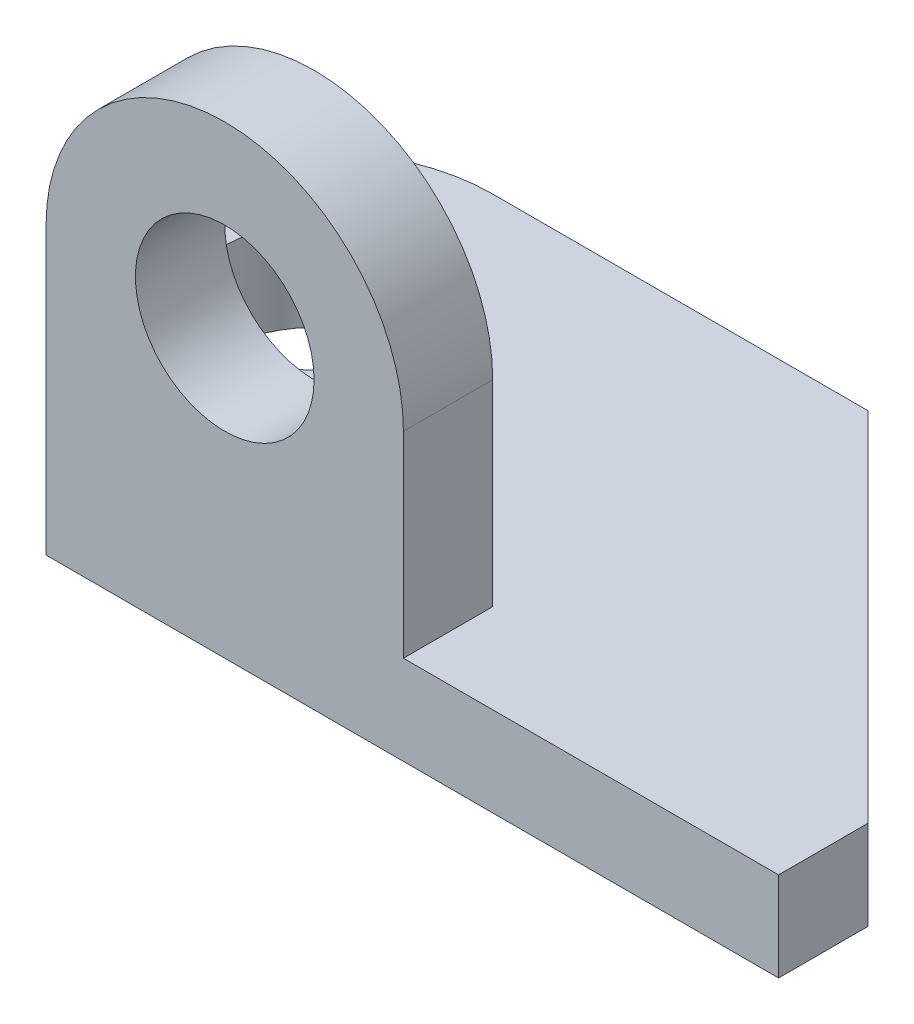
ISO-10303-21;
HEADER;
FILE_DESCRIPTION(('STEP AP214'),'2;1');
FILE_NAME('part.step','',(''),(''),'','','');
FILE_SCHEMA(('AUTOMOTIVE_DESIGN { 1 0 10303 214 1 1 1 1 }'));
ENDSEC;
DATA;
#1=APPLICATION_CONTEXT('core data for automotive mechanical design processes');
#2=APPLICATION_PROTOCOL_DEFINITION('international standard','automotive_design',2000,#1);
#3=PRODUCT_CONTEXT('',#1,'mechanical');
#4=PRODUCT('Part','Part','',(#3));
#5=PRODUCT_RELATED_PRODUCT_CATEGORY('part','',(#4));
#6=PRODUCT_DEFINITION_FORMATION('','',#4);
#7=PRODUCT_DEFINITION_CONTEXT('part definition',#1,'design');
#8=PRODUCT_DEFINITION('design','',#6,#7);
#9=PRODUCT_DEFINITION_SHAPE('','',#8);
#10=(LENGTH_UNIT() NAMED_UNIT(*) SI_UNIT(.MILLI.,.METRE.));
#11=(NAMED_UNIT(*) PLANE_ANGLE_UNIT() SI_UNIT($,.RADIAN.));
#12=(NAMED_UNIT(*) SI_UNIT($,.STERADIAN.) SOLID_ANGLE_UNIT());
#13=UNCERTAINTY_MEASURE_WITH_UNIT(LENGTH_MEASURE(1.E-05),#10,'distance_accuracy_value','');
#14=(GEOMETRIC_REPRESENTATION_CONTEXT(3) GLOBAL_UNCERTAINTY_ASSIGNED_CONTEXT((#13)) GLOBAL_UNIT_ASSIGNED_CONTEXT((#10,
#11,#12)) REPRESENTATION_CONTEXT('',''));
#15=CARTESIAN_POINT('',(0.,0.,0.));
#16=DIRECTION('',(0.,0.,1.));
#17=DIRECTION('',(1.,0.,0.));
#18=AXIS2_PLACEMENT_3D('',#15,#16,#17);
#19=CARTESIAN_POINT('',(0.,254.,-762.));
#20=DIRECTION('',(0.,-1.,0.));
#21=DIRECTION('',(0.,0.,-1.));
#22=AXIS2_PLACEMENT_3D('',#19,#20,#21);
#23=CYLINDRICAL_SURFACE('',#22,508.);
#24=CARTESIAN_POINT('',(0.,0.,-762.));
#25=DIRECTION('',(0.,1.,0.));
#26=DIRECTION('',(0.,0.,1.));
#27=AXIS2_PLACEMENT_3D('',#24,#25,#26);
#28=CIRCLE('',#27,508.);
#29=CARTESIAN_POINT('',(-1.24424117310977E-13,0.,-1270.));
#30=VERTEX_POINT('',#29);
#31=CARTESIAN_POINT('',(0.,0.,-254.));
#32=VERTEX_POINT('',#31);
#33=EDGE_CURVE('E146',#30,#32,#28,.T.);
#34=ORIENTED_EDGE('',*,*,#33,.T.);
#35=DIRECTION('',(0.,-1.,0.));
#36=VECTOR('',#35,1.);
#37=CARTESIAN_POINT('',(0.,254.,-254.));
#38=LINE('',#37,#36);
#39=CARTESIAN_POINT('',(0.,254.,-254.));
#40=VERTEX_POINT('',#39);
#41=EDGE_CURVE('E11',#40,#32,#38,.T.);
#42=ORIENTED_EDGE('',*,*,#41,.F.);
#43=CARTESIAN_POINT('',(0.,254.,-762.));
#44=DIRECTION('',(0.,1.,0.));
#45=DIRECTION('',(0.,0.,1.));
#46=AXIS2_PLACEMENT_3D('',#43,#44,#45);
#47=CIRCLE('',#46,508.);
#48=CARTESIAN_POINT('',(-1.24424117310977E-13,254.,-1270.));
#49=VERTEX_POINT('',#48);
#50=EDGE_CURVE('E148',#49,#40,#47,.T.);
#51=ORIENTED_EDGE('',*,*,#50,.F.);
#52=DIRECTION('',(0.,-1.,0.));
#53=VECTOR('',#52,1.);
#54=CARTESIAN_POINT('',(-1.24424117310977E-13,254.,-1270.));
#55=LINE('',#54,#53);
#56=EDGE_CURVE('E160',#49,#30,#55,.T.);
#57=ORIENTED_EDGE('',*,*,#56,.T.);
#58=EDGE_LOOP('',(#34,#42,#51,#57));
#59=FACE_BOUND('',#58,.T.);
#60=ADVANCED_FACE('F33',(#59),#23,.T.);
#61=CARTESIAN_POINT('',(0.,254.,0.));
#62=DIRECTION('',(1.,0.,0.));
#63=DIRECTION('',(0.,0.,-1.));
#64=AXIS2_PLACEMENT_3D('',#61,#62,#63);
#65=PLANE('',#64);
#66=DIRECTION('',(0.,0.,1.));
#67=VECTOR('',#66,1.);
#68=CARTESIAN_POINT('',(0.,0.,0.));
#69=LINE('',#68,#67);
#70=CARTESIAN_POINT('',(0.,0.,0.));
#71=VERTEX_POINT('',#70);
#72=EDGE_CURVE('E163',#32,#71,#69,.T.);
#73=ORIENTED_EDGE('',*,*,#72,.T.);
#74=DIRECTION('',(0.,-1.,0.));
#75=VECTOR('',#74,1.);
#76=CARTESIAN_POINT('',(0.,254.,0.));
#77=LINE('',#76,#75);
#78=CARTESIAN_POINT('',(0.,812.8,0.));
#79=VERTEX_POINT('',#78);
#80=EDGE_CURVE('E40',#79,#71,#77,.T.);
#81=ORIENTED_EDGE('',*,*,#80,.F.);
#82=DIRECTION('',(0.,0.,1.));
#83=VECTOR('',#82,1.);
#84=CARTESIAN_POINT('',(0.,812.8,-254.));
#85=LINE('',#84,#83);
#86=CARTESIAN_POINT('',(0.,812.8,-254.));
#87=VERTEX_POINT('',#86);
#88=EDGE_CURVE('E121',#87,#79,#85,.T.);
#89=ORIENTED_EDGE('',*,*,#88,.F.);
#90=DIRECTION('',(0.,1.,0.));
#91=VECTOR('',#90,1.);
#92=CARTESIAN_POINT('',(0.,0.,-254.));
#93=LINE('',#92,#91);
#94=EDGE_CURVE('E110',#40,#87,#93,.T.);
#95=ORIENTED_EDGE('',*,*,#94,.F.);
#96=ORIENTED_EDGE('',*,*,#41,.T.);
#97=EDGE_LOOP('',(#73,#81,#89,#95,#96));
#98=FACE_BOUND('',#97,.T.);
#99=ADVANCED_FACE('F122',(#98),#65,.F.);
#100=CARTESIAN_POINT('',(0.,254.,0.));
#101=DIRECTION('',(0.,0.,-1.));
#102=DIRECTION('',(-1.,0.,0.));
#103=AXIS2_PLACEMENT_3D('',#100,#101,#102);
#104=PLANE('',#103);
#105=DIRECTION('',(1.,0.,0.));
#106=VECTOR('',#105,1.);
#107=CARTESIAN_POINT('',(0.,0.,0.));
#108=LINE('',#107,#106);
#109=CARTESIAN_POINT('',(2082.8,0.,0.));
#110=VERTEX_POINT('',#109);
#111=EDGE_CURVE('E165',#71,#110,#108,.T.);
#112=ORIENTED_EDGE('',*,*,#111,.T.);
#113=DIRECTION('',(0.,-1.,0.));
#114=VECTOR('',#113,1.);
#115=CARTESIAN_POINT('',(2082.8,254.,0.));
#116=LINE('',#115,#114);
#117=CARTESIAN_POINT('',(2082.8,254.,0.));
#118=VERTEX_POINT('',#117);
#119=EDGE_CURVE('E180',#118,#110,#116,.T.);
#120=ORIENTED_EDGE('',*,*,#119,.F.);
#121=DIRECTION('',(1.,0.,0.));
#122=VECTOR('',#121,1.);
#123=CARTESIAN_POINT('',(0.,254.,0.));
#124=LINE('',#123,#122);
#125=CARTESIAN_POINT('',(1016.,254.,0.));
#126=VERTEX_POINT('',#125);
#127=EDGE_CURVE('E89',#126,#118,#124,.T.);
#128=ORIENTED_EDGE('',*,*,#127,.F.);
#129=DIRECTION('',(0.,-1.,0.));
#130=VECTOR('',#129,1.);
#131=CARTESIAN_POINT('',(1016.,0.,0.));
#132=LINE('',#131,#130);
#133=CARTESIAN_POINT('',(1016.,812.8,0.));
#134=VERTEX_POINT('',#133);
#135=EDGE_CURVE('E47',#134,#126,#132,.T.);
#136=ORIENTED_EDGE('',*,*,#135,.F.);
#137=CARTESIAN_POINT('',(508.,812.8,0.));
#138=DIRECTION('',(0.,0.,1.));
#139=DIRECTION('',(1.,0.,0.));
#140=AXIS2_PLACEMENT_3D('',#137,#138,#139);
#141=CIRCLE('',#140,508.);
#142=EDGE_CURVE('E142',#79,#134,#141,.F.);
#143=ORIENTED_EDGE('',*,*,#142,.F.);
#144=ORIENTED_EDGE('',*,*,#80,.T.);
#145=EDGE_LOOP('',(#112,#120,#128,#136,#143,#144));
#146=FACE_BOUND('',#145,.T.);
#147=CARTESIAN_POINT('',(508.,812.8,0.));
#148=DIRECTION('',(0.,0.,1.));
#149=DIRECTION('',(1.,0.,0.));
#150=AXIS2_PLACEMENT_3D('',#147,#148,#149);
#151=CIRCLE('',#150,254.);
#152=CARTESIAN_POINT('',(762.,812.8,0.));
#153=VERTEX_POINT('',#152);
#154=EDGE_CURVE('E139',#153,#153,#151,.T.);
#155=ORIENTED_EDGE('',*,*,#154,.F.);
#156=EDGE_LOOP('',(#155));
#157=FACE_BOUND('',#156,.T.);
#158=ADVANCED_FACE('F184',(#146,#157),#104,.F.);
#159=CARTESIAN_POINT('',(2082.8,254.,0.));
#160=DIRECTION('',(-1.,0.,0.));
#161=DIRECTION('',(0.,0.,1.));
#162=AXIS2_PLACEMENT_3D('',#159,#160,#161);
#163=PLANE('',#162);
#164=DIRECTION('',(0.,0.,-1.));
#165=VECTOR('',#164,1.);
#166=CARTESIAN_POINT('',(2082.8,0.,0.));
#167=LINE('',#166,#165);
#168=CARTESIAN_POINT('',(2082.8,0.,-254.));
#169=VERTEX_POINT('',#168);
#170=EDGE_CURVE('E167',#110,#169,#167,.T.);
#171=ORIENTED_EDGE('',*,*,#170,.T.);
#172=DIRECTION('',(0.,-1.,0.));
#173=VECTOR('',#172,1.);
#174=CARTESIAN_POINT('',(2082.8,254.,-254.));
#175=LINE('',#174,#173);
#176=CARTESIAN_POINT('',(2082.8,254.,-254.));
#177=VERTEX_POINT('',#176);
#178=EDGE_CURVE('E177',#177,#169,#175,.T.);
#179=ORIENTED_EDGE('',*,*,#178,.F.);
#180=DIRECTION('',(0.,0.,-1.));
#181=VECTOR('',#180,1.);
#182=CARTESIAN_POINT('',(2082.8,254.,0.));
#183=LINE('',#182,#181);
#184=EDGE_CURVE('E152',#118,#177,#183,.T.);
#185=ORIENTED_EDGE('',*,*,#184,.F.);
#186=ORIENTED_EDGE('',*,*,#119,.T.);
#187=EDGE_LOOP('',(#171,#179,#185,#186));
#188=FACE_BOUND('',#187,.T.);
#189=ADVANCED_FACE('F194',(#188),#163,.F.);
#190=CARTESIAN_POINT('',(1168.4,254.,-1168.4));
#191=DIRECTION('',(-0.707106781186547,0.,0.707106781186548));
#192=DIRECTION('',(0.707106781186548,0.,0.707106781186547));
#193=AXIS2_PLACEMENT_3D('',#190,#191,#192);
#194=PLANE('',#193);
#195=DIRECTION('',(-0.707106781186548,0.,-0.707106781186547));
#196=VECTOR('',#195,1.);
#197=CARTESIAN_POINT('',(1168.4,0.,-1168.4));
#198=LINE('',#197,#196);
#199=CARTESIAN_POINT('',(1066.8,0.,-1270.));
#200=VERTEX_POINT('',#199);
#201=EDGE_CURVE('E169',#169,#200,#198,.T.);
#202=ORIENTED_EDGE('',*,*,#201,.T.);
#203=DIRECTION('',(0.,-1.,0.));
#204=VECTOR('',#203,1.);
#205=CARTESIAN_POINT('',(1066.8,254.,-1270.));
#206=LINE('',#205,#204);
#207=CARTESIAN_POINT('',(1066.8,254.,-1270.));
#208=VERTEX_POINT('',#207);
#209=EDGE_CURVE('E175',#208,#200,#206,.T.);
#210=ORIENTED_EDGE('',*,*,#209,.F.);
#211=DIRECTION('',(-0.707106781186548,0.,-0.707106781186547));
#212=VECTOR('',#211,1.);
#213=CARTESIAN_POINT('',(1168.4,254.,-1168.4));
#214=LINE('',#213,#212);
#215=EDGE_CURVE('E154',#177,#208,#214,.T.);
#216=ORIENTED_EDGE('',*,*,#215,.F.);
#217=ORIENTED_EDGE('',*,*,#178,.T.);
#218=EDGE_LOOP('',(#202,#210,#216,#217));
#219=FACE_BOUND('',#218,.T.);
#220=ADVANCED_FACE('F198',(#219),#194,.F.);
#221=CARTESIAN_POINT('',(0.,254.,-1270.));
#222=DIRECTION('',(0.,0.,1.));
#223=DIRECTION('',(1.,0.,0.));
#224=AXIS2_PLACEMENT_3D('',#221,#222,#223);
#225=PLANE('',#224);
#226=DIRECTION('',(-1.,0.,0.));
#227=VECTOR('',#226,1.);
#228=CARTESIAN_POINT('',(0.,0.,-1270.));
#229=LINE('',#228,#227);
#230=EDGE_CURVE('E83',#200,#30,#229,.T.);
#231=ORIENTED_EDGE('',*,*,#230,.T.);
#232=ORIENTED_EDGE('',*,*,#56,.F.);
#233=DIRECTION('',(-1.,0.,0.));
#234=VECTOR('',#233,1.);
#235=CARTESIAN_POINT('',(0.,254.,-1270.));
#236=LINE('',#235,#234);
#237=EDGE_CURVE('E56',#208,#49,#236,.T.);
#238=ORIENTED_EDGE('',*,*,#237,.F.);
#239=ORIENTED_EDGE('',*,*,#209,.T.);
#240=EDGE_LOOP('',(#231,#232,#238,#239));
#241=FACE_BOUND('',#240,.T.);
#242=ADVANCED_FACE('F209',(#241),#225,.F.);
#243=CARTESIAN_POINT('',(0.,254.,-762.));
#244=DIRECTION('',(0.,-1.,0.));
#245=DIRECTION('',(0.,0.,-1.));
#246=AXIS2_PLACEMENT_3D('',#243,#244,#245);
#247=CYLINDRICAL_SURFACE('',#246,254.);
#248=CARTESIAN_POINT('',(0.,254.,-762.));
#249=DIRECTION('',(0.,1.,0.));
#250=DIRECTION('',(0.,0.,1.));
#251=AXIS2_PLACEMENT_3D('',#248,#249,#250);
#252=CIRCLE('',#251,254.);
#253=CARTESIAN_POINT('',(0.,254.,-508.));
#254=VERTEX_POINT('',#253);
#255=EDGE_CURVE('E157',#254,#254,#252,.T.);
#256=ORIENTED_EDGE('',*,*,#255,.T.);
#257=EDGE_LOOP('',(#256));
#258=FACE_BOUND('',#257,.T.);
#259=CARTESIAN_POINT('',(0.,0.,-762.));
#260=DIRECTION('',(0.,1.,0.));
#261=DIRECTION('',(0.,0.,1.));
#262=AXIS2_PLACEMENT_3D('',#259,#260,#261);
#263=CIRCLE('',#262,254.);
#264=CARTESIAN_POINT('',(0.,0.,-508.));
#265=VERTEX_POINT('',#264);
#266=EDGE_CURVE('E150',#265,#265,#263,.T.);
#267=ORIENTED_EDGE('',*,*,#266,.F.);
#268=EDGE_LOOP('',(#267));
#269=FACE_BOUND('',#268,.T.);
#270=ADVANCED_FACE('F203',(#258,#269),#247,.F.);
#271=CARTESIAN_POINT('',(0.,254.,0.));
#272=DIRECTION('',(0.,1.,0.));
#273=DIRECTION('',(0.,0.,1.));
#274=AXIS2_PLACEMENT_3D('',#271,#272,#273);
#275=PLANE('',#274);
#276=DIRECTION('',(-1.,0.,0.));
#277=VECTOR('',#276,1.);
#278=CARTESIAN_POINT('',(0.,254.,-254.));
#279=LINE('',#278,#277);
#280=CARTESIAN_POINT('',(1016.,254.,-254.));
#281=VERTEX_POINT('',#280);
#282=EDGE_CURVE('E117',#281,#40,#279,.T.);
#283=ORIENTED_EDGE('',*,*,#282,.F.);
#284=DIRECTION('',(0.,0.,1.));
#285=VECTOR('',#284,1.);
#286=CARTESIAN_POINT('',(1016.,254.,-254.));
#287=LINE('',#286,#285);
#288=EDGE_CURVE('E127',#281,#126,#287,.T.);
#289=ORIENTED_EDGE('',*,*,#288,.T.);
#290=ORIENTED_EDGE('',*,*,#127,.T.);
#291=ORIENTED_EDGE('',*,*,#184,.T.);
#292=ORIENTED_EDGE('',*,*,#215,.T.);
#293=ORIENTED_EDGE('',*,*,#237,.T.);
#294=ORIENTED_EDGE('',*,*,#50,.T.);
#295=EDGE_LOOP('',(#283,#289,#290,#291,#292,#293,#294));
#296=FACE_BOUND('',#295,.T.);
#297=ORIENTED_EDGE('',*,*,#255,.F.);
#298=EDGE_LOOP('',(#297));
#299=FACE_BOUND('',#298,.T.);
#300=ADVANCED_FACE('F200',(#296,#299),#275,.T.);
#301=CARTESIAN_POINT('',(0.,0.,0.));
#302=DIRECTION('',(0.,1.,0.));
#303=DIRECTION('',(0.,0.,1.));
#304=AXIS2_PLACEMENT_3D('',#301,#302,#303);
#305=PLANE('',#304);
#306=ORIENTED_EDGE('',*,*,#33,.F.);
#307=ORIENTED_EDGE('',*,*,#230,.F.);
#308=ORIENTED_EDGE('',*,*,#201,.F.);
#309=ORIENTED_EDGE('',*,*,#170,.F.);
#310=ORIENTED_EDGE('',*,*,#111,.F.);
#311=ORIENTED_EDGE('',*,*,#72,.F.);
#312=EDGE_LOOP('',(#306,#307,#308,#309,#310,#311));
#313=FACE_BOUND('',#312,.T.);
#314=ORIENTED_EDGE('',*,*,#266,.T.);
#315=EDGE_LOOP('',(#314));
#316=FACE_BOUND('',#315,.T.);
#317=ADVANCED_FACE('F189',(#313,#316),#305,.F.);
#318=CARTESIAN_POINT('',(508.,812.8,-254.));
#319=DIRECTION('',(0.,0.,1.));
#320=DIRECTION('',(1.,0.,0.));
#321=AXIS2_PLACEMENT_3D('',#318,#319,#320);
#322=CYLINDRICAL_SURFACE('',#321,508.);
#323=ORIENTED_EDGE('',*,*,#142,.T.);
#324=DIRECTION('',(0.,0.,1.));
#325=VECTOR('',#324,1.);
#326=CARTESIAN_POINT('',(1016.,812.8,-254.));
#327=LINE('',#326,#325);
#328=CARTESIAN_POINT('',(1016.,812.8,-254.));
#329=VERTEX_POINT('',#328);
#330=EDGE_CURVE('E131',#329,#134,#327,.T.);
#331=ORIENTED_EDGE('',*,*,#330,.F.);
#332=CARTESIAN_POINT('',(508.,812.8,-254.));
#333=DIRECTION('',(0.,0.,1.));
#334=DIRECTION('',(1.,0.,0.));
#335=AXIS2_PLACEMENT_3D('',#332,#333,#334);
#336=CIRCLE('',#335,508.);
#337=EDGE_CURVE('E114',#87,#329,#336,.F.);
#338=ORIENTED_EDGE('',*,*,#337,.F.);
#339=ORIENTED_EDGE('',*,*,#88,.T.);
#340=EDGE_LOOP('',(#323,#331,#338,#339));
#341=FACE_BOUND('',#340,.T.);
#342=ADVANCED_FACE('F130',(#341),#322,.T.);
#343=CARTESIAN_POINT('',(1016.,0.,-254.));
#344=DIRECTION('',(-1.,0.,0.));
#345=DIRECTION('',(0.,0.,1.));
#346=AXIS2_PLACEMENT_3D('',#343,#344,#345);
#347=PLANE('',#346);
#348=ORIENTED_EDGE('',*,*,#135,.T.);
#349=ORIENTED_EDGE('',*,*,#288,.F.);
#350=DIRECTION('',(0.,-1.,0.));
#351=VECTOR('',#350,1.);
#352=CARTESIAN_POINT('',(1016.,0.,-254.));
#353=LINE('',#352,#351);
#354=EDGE_CURVE('E128',#329,#281,#353,.T.);
#355=ORIENTED_EDGE('',*,*,#354,.F.);
#356=ORIENTED_EDGE('',*,*,#330,.T.);
#357=EDGE_LOOP('',(#348,#349,#355,#356));
#358=FACE_BOUND('',#357,.T.);
#359=ADVANCED_FACE('F217',(#358),#347,.F.);
#360=CARTESIAN_POINT('',(508.,812.8,-254.));
#361=DIRECTION('',(0.,0.,1.));
#362=DIRECTION('',(1.,0.,0.));
#363=AXIS2_PLACEMENT_3D('',#360,#361,#362);
#364=CYLINDRICAL_SURFACE('',#363,254.);
#365=CARTESIAN_POINT('',(508.,812.8,-254.));
#366=DIRECTION('',(0.,0.,1.));
#367=DIRECTION('',(1.,0.,0.));
#368=AXIS2_PLACEMENT_3D('',#365,#366,#367);
#369=CIRCLE('',#368,254.);
#370=CARTESIAN_POINT('',(762.,812.8,-254.));
#371=VERTEX_POINT('',#370);
#372=EDGE_CURVE('E132',#371,#371,#369,.T.);
#373=ORIENTED_EDGE('',*,*,#372,.F.);
#374=EDGE_LOOP('',(#373));
#375=FACE_BOUND('',#374,.T.);
#376=ORIENTED_EDGE('',*,*,#154,.T.);
#377=EDGE_LOOP('',(#376));
#378=FACE_BOUND('',#377,.T.);
#379=ADVANCED_FACE('F297',(#375,#378),#364,.F.);
#380=CARTESIAN_POINT('',(0.,0.,-254.));
#381=DIRECTION('',(0.,0.,1.));
#382=DIRECTION('',(1.,0.,0.));
#383=AXIS2_PLACEMENT_3D('',#380,#381,#382);
#384=PLANE('',#383);
#385=ORIENTED_EDGE('',*,*,#372,.T.);
#386=EDGE_LOOP('',(#385));
#387=FACE_BOUND('',#386,.T.);
#388=ORIENTED_EDGE('',*,*,#337,.T.);
#389=ORIENTED_EDGE('',*,*,#354,.T.);
#390=ORIENTED_EDGE('',*,*,#282,.T.);
#391=ORIENTED_EDGE('',*,*,#94,.T.);
#392=EDGE_LOOP('',(#388,#389,#390,#391));
#393=FACE_BOUND('',#392,.T.);
#394=ADVANCED_FACE('F112',(#387,#393),#384,.F.);
#395=CLOSED_SHELL('',(#60,#99,#158,#189,#220,#242,#270,#300,#317,#342,#359,#379,#394));
#396=MANIFOLD_SOLID_BREP('B2',#395);
#397=ADVANCED_BREP_SHAPE_REPRESENTATION('',(#18,#396),#14);
#398=SHAPE_DEFINITION_REPRESENTATION(#9,#397);
ENDSEC;
END-ISO-10303-21;
